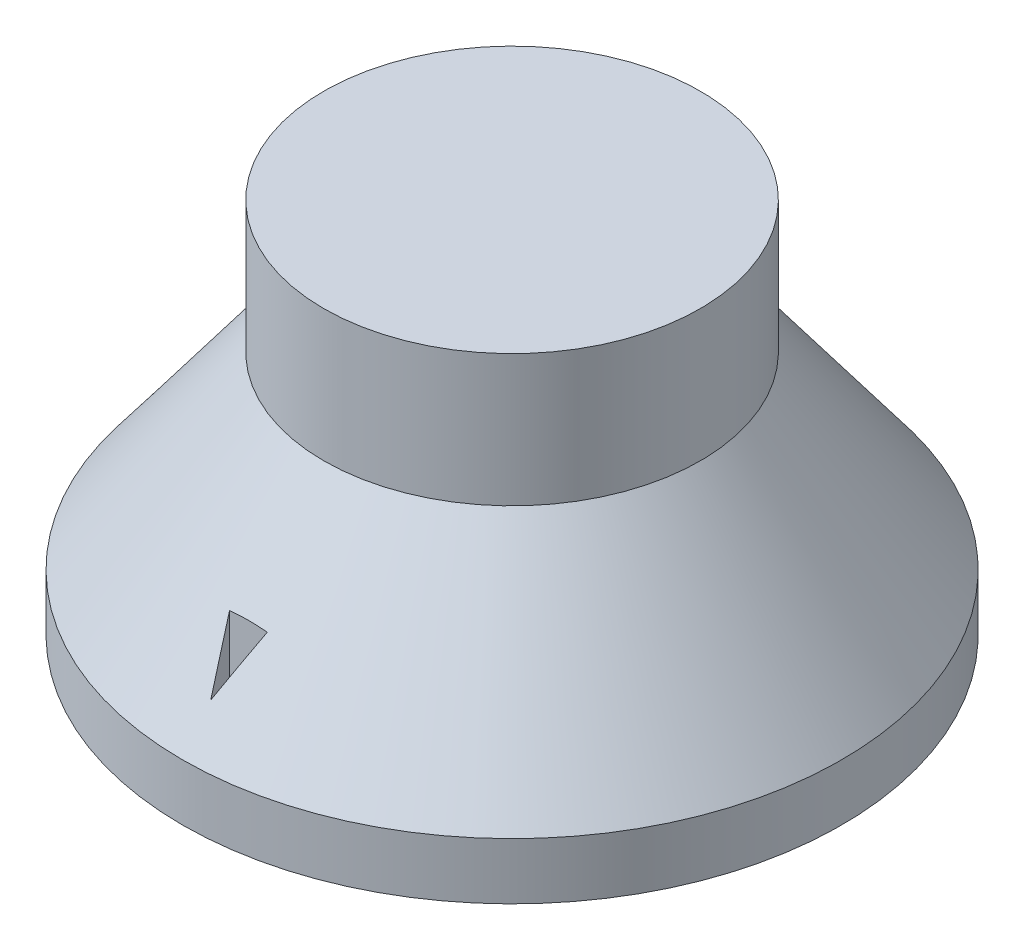
ISO-10303-21;
HEADER;
FILE_DESCRIPTION(('STEP AP214'),'2;1');
FILE_NAME('part.step','',(''),(''),'','','');
FILE_SCHEMA(('AUTOMOTIVE_DESIGN { 1 0 10303 214 1 1 1 1 }'));
ENDSEC;
DATA;
#1=APPLICATION_CONTEXT('core data for automotive mechanical design processes');
#2=APPLICATION_PROTOCOL_DEFINITION('international standard','automotive_design',2000,#1);
#3=PRODUCT_CONTEXT('',#1,'mechanical');
#4=PRODUCT('Part','Part','',(#3));
#5=PRODUCT_RELATED_PRODUCT_CATEGORY('part','',(#4));
#6=PRODUCT_DEFINITION_FORMATION('','',#4);
#7=PRODUCT_DEFINITION_CONTEXT('part definition',#1,'design');
#8=PRODUCT_DEFINITION('design','',#6,#7);
#9=PRODUCT_DEFINITION_SHAPE('','',#8);
#10=(LENGTH_UNIT() NAMED_UNIT(*) SI_UNIT(.MILLI.,.METRE.));
#11=(NAMED_UNIT(*) PLANE_ANGLE_UNIT() SI_UNIT($,.RADIAN.));
#12=(NAMED_UNIT(*) SI_UNIT($,.STERADIAN.) SOLID_ANGLE_UNIT());
#13=UNCERTAINTY_MEASURE_WITH_UNIT(LENGTH_MEASURE(1.E-05),#10,'distance_accuracy_value','');
#14=(GEOMETRIC_REPRESENTATION_CONTEXT(3) GLOBAL_UNCERTAINTY_ASSIGNED_CONTEXT((#13)) GLOBAL_UNIT_ASSIGNED_CONTEXT((#10,
#11,#12)) REPRESENTATION_CONTEXT('',''));
#15=CARTESIAN_POINT('',(0.,0.,0.));
#16=DIRECTION('',(0.,0.,1.));
#17=DIRECTION('',(1.,0.,0.));
#18=AXIS2_PLACEMENT_3D('',#15,#16,#17);
#19=CARTESIAN_POINT('',(0.,0.,0.));
#20=DIRECTION('',(0.,-1.,0.));
#21=DIRECTION('',(0.,0.,-1.));
#22=AXIS2_PLACEMENT_3D('',#19,#20,#21);
#23=PLANE('',#22);
#24=CARTESIAN_POINT('',(0.,0.,0.));
#25=DIRECTION('',(0.,-1.,0.));
#26=DIRECTION('',(0.,0.,-1.));
#27=AXIS2_PLACEMENT_3D('',#24,#25,#26);
#28=CIRCLE('',#27,3.175);
#29=CARTESIAN_POINT('',(0.,0.,-3.175));
#30=VERTEX_POINT('',#29);
#31=CARTESIAN_POINT('',(2.74963065701559,0.,1.5875));
#32=VERTEX_POINT('',#31);
#33=EDGE_CURVE('E658',#30,#32,#28,.T.);
#34=ORIENTED_EDGE('',*,*,#33,.F.);
#35=DIRECTION('',(0.866025403784439,0.,-0.5));
#36=VECTOR('',#35,1.);
#37=CARTESIAN_POINT('',(-1.3748153285078,0.,-2.38125));
#38=LINE('',#37,#36);
#39=CARTESIAN_POINT('',(4.77969102354839,0.,-5.9345558990889));
#40=VERTEX_POINT('',#39);
#41=EDGE_CURVE('E256',#30,#40,#38,.T.);
#42=ORIENTED_EDGE('',*,*,#41,.T.);
#43=CARTESIAN_POINT('',(0.,0.,0.));
#44=DIRECTION('',(0.,-1.,0.));
#45=DIRECTION('',(0.,0.,-1.));
#46=AXIS2_PLACEMENT_3D('',#43,#44,#45);
#47=CIRCLE('',#46,7.62);
#48=CARTESIAN_POINT('',(7.52932168056399,0.,-1.1720558990889));
#49=VERTEX_POINT('',#48);
#50=EDGE_CURVE('E260',#40,#49,#47,.T.);
#51=ORIENTED_EDGE('',*,*,#50,.T.);
#52=DIRECTION('',(-0.866025403784439,0.,0.5));
#53=VECTOR('',#52,1.);
#54=CARTESIAN_POINT('',(1.3748153285078,0.,2.38125));
#55=LINE('',#54,#53);
#56=EDGE_CURVE('E265',#49,#32,#55,.T.);
#57=ORIENTED_EDGE('',*,*,#56,.T.);
#58=EDGE_LOOP('',(#34,#42,#51,#57));
#59=FACE_BOUND('',#58,.T.);
#60=ADVANCED_FACE('F16',(#59),#23,.T.);
#61=CARTESIAN_POINT('',(-2.74963065701559,0.,1.5875));
#62=VERTEX_POINT('',#61);
#63=EDGE_CURVE('E655',#32,#62,#28,.T.);
#64=ORIENTED_EDGE('',*,*,#63,.F.);
#65=DIRECTION('',(0.,0.,1.));
#66=VECTOR('',#65,1.);
#67=CARTESIAN_POINT('',(2.74963065701559,0.,0.));
#68=LINE('',#67,#66);
#69=CARTESIAN_POINT('',(2.74963065701559,0.,7.10661179817781));
#70=VERTEX_POINT('',#69);
#71=EDGE_CURVE('E278',#32,#70,#68,.T.);
#72=ORIENTED_EDGE('',*,*,#71,.T.);
#73=CARTESIAN_POINT('',(0.,0.,0.));
#74=DIRECTION('',(0.,-1.,0.));
#75=DIRECTION('',(0.,0.,-1.));
#76=AXIS2_PLACEMENT_3D('',#73,#74,#75);
#77=CIRCLE('',#76,7.62);
#78=CARTESIAN_POINT('',(-2.74963065701559,0.,7.1066117981778));
#79=VERTEX_POINT('',#78);
#80=EDGE_CURVE('E282',#70,#79,#77,.T.);
#81=ORIENTED_EDGE('',*,*,#80,.T.);
#82=DIRECTION('',(0.,0.,-1.));
#83=VECTOR('',#82,1.);
#84=CARTESIAN_POINT('',(-2.74963065701559,0.,0.));
#85=LINE('',#84,#83);
#86=EDGE_CURVE('E287',#79,#62,#85,.T.);
#87=ORIENTED_EDGE('',*,*,#86,.T.);
#88=EDGE_LOOP('',(#64,#72,#81,#87));
#89=FACE_BOUND('',#88,.T.);
#90=ADVANCED_FACE('F401',(#89),#23,.T.);
#91=CARTESIAN_POINT('',(0.,12.7,0.));
#92=DIRECTION('',(0.,-1.,0.));
#93=DIRECTION('',(0.,0.,-1.));
#94=AXIS2_PLACEMENT_3D('',#91,#92,#93);
#95=CONICAL_SURFACE('',#94,12.7,0.643501108793284);
#96=CARTESIAN_POINT('',(0.,0.,0.));
#97=DIRECTION('',(0.,1.,0.));
#98=DIRECTION('',(0.,0.,1.));
#99=AXIS2_PLACEMENT_3D('',#96,#97,#98);
#100=CIRCLE('',#99,22.225);
#101=CARTESIAN_POINT('',(0.,0.,22.225));
#102=VERTEX_POINT('',#101);
#103=EDGE_CURVE('E376',#102,#102,#100,.T.);
#104=ORIENTED_EDGE('',*,*,#103,.T.);
#105=EDGE_LOOP('',(#104));
#106=FACE_BOUND('',#105,.T.);
#107=CARTESIAN_POINT('',(0.,12.7,0.));
#108=DIRECTION('',(0.,1.,0.));
#109=DIRECTION('',(0.,0.,1.));
#110=AXIS2_PLACEMENT_3D('',#107,#108,#109);
#111=CIRCLE('',#110,12.7);
#112=CARTESIAN_POINT('',(0.,12.7,12.7));
#113=VERTEX_POINT('',#112);
#114=EDGE_CURVE('E10',#113,#113,#111,.T.);
#115=ORIENTED_EDGE('',*,*,#114,.F.);
#116=EDGE_LOOP('',(#115));
#117=FACE_BOUND('',#116,.T.);
#118=CARTESIAN_POINT('',(1.2701,5.86652390692712,17.7798));
#119=CARTESIAN_POINT('',(1.1629716888854,5.59174236568698,17.9940566222292));
#120=CARTESIAN_POINT('',(1.05621004871273,5.31624780296918,18.2075799025745));
#121=CARTESIAN_POINT('',(0.843349553580448,4.76399211063045,18.6333008928391));
#122=CARTESIAN_POINT('',(0.737250683513074,4.48723101013108,18.8454986329739));
#123=CARTESIAN_POINT('',(0.525640731324512,3.93259032260224,19.268718537351));
#124=CARTESIAN_POINT('',(0.420129646679655,3.65471074038385,19.4797407066407));
#125=CARTESIAN_POINT('',(0.20963395631367,3.09794527284853,19.9007320873727));
#126=CARTESIAN_POINT('',(0.10464936268366,2.81905936467146,20.1107012746327));
#127=CARTESIAN_POINT('',(-0.000100000000017459,2.53973333300529,20.3202));
#128=B_SPLINE_CURVE_WITH_KNOTS('',3,(#118,#119,#120,#121,#122,#123,#124,#125,#126,#127),
.UNSPECIFIED.,.F.,.F.,(4,2,2,2,4),(0.,1.09360768033873,2.1871903404029,3.2807683015217,
4.37437126321508),.UNSPECIFIED.);
#129=CARTESIAN_POINT('',(1.27,5.86626741803318,17.78));
#130=VERTEX_POINT('',#129);
#131=CARTESIAN_POINT('',(0.,2.54,20.32));
#132=VERTEX_POINT('',#131);
#133=EDGE_CURVE('E170',#130,#132,#128,.T.);
#134=ORIENTED_EDGE('',*,*,#133,.T.);
#135=CARTESIAN_POINT('',(0.000100000000000184,2.53973333300526,20.3202));
#136=CARTESIAN_POINT('',(-0.104649362683665,2.81905936467145,20.1107012746327));
#137=CARTESIAN_POINT('',(-0.20963395631367,3.09794527284853,19.9007320873727));
#138=CARTESIAN_POINT('',(-0.420129646679652,3.65471074038386,19.4797407066407));
#139=CARTESIAN_POINT('',(-0.525640731324511,3.93259032260225,19.268718537351));
#140=CARTESIAN_POINT('',(-0.737250683513073,4.48723101013108,18.8454986329739));
#141=CARTESIAN_POINT('',(-0.843349553580447,4.76399211063046,18.6333008928391));
#142=CARTESIAN_POINT('',(-1.05621004871273,5.31624780296918,18.2075799025745));
#143=CARTESIAN_POINT('',(-1.1629716888854,5.59174236568698,17.9940566222292));
#144=CARTESIAN_POINT('',(-1.2701,5.86652390692713,17.7798));
#145=B_SPLINE_CURVE_WITH_KNOTS('',3,(#135,#136,#137,#138,#139,#140,#141,#142,#143,#144),
.UNSPECIFIED.,.F.,.F.,(4,2,2,2,4),(0.,1.09360296169338,2.18718092281218,3.28076358287635,
4.37437126321508),.UNSPECIFIED.);
#146=CARTESIAN_POINT('',(-1.27,5.86626741803318,17.78));
#147=VERTEX_POINT('',#146);
#148=EDGE_CURVE('E39',#132,#147,#145,.T.);
#149=ORIENTED_EDGE('',*,*,#148,.T.);
#150=CARTESIAN_POINT('',(-14.2217095645257,-0.724105379815956,17.78));
#151=CARTESIAN_POINT('',(-13.9453417803753,-0.493960475211913,17.78));
#152=CARTESIAN_POINT('',(-13.6669740552298,-0.266189689392707,17.78));
#153=CARTESIAN_POINT('',(-13.1057793867715,0.183885731205781,17.78));
#154=CARTESIAN_POINT('',(-12.8229516881035,0.406189423382434,17.78));
#155=CARTESIAN_POINT('',(-12.2515097967928,0.845272822030037,17.78));
#156=CARTESIAN_POINT('',(-11.9628793015656,1.06203136237858,17.78));
#157=CARTESIAN_POINT('',(-11.3803168810772,1.48828989595809,17.78));
#158=CARTESIAN_POINT('',(-11.0863851891637,1.69779020750148,17.78));
#159=CARTESIAN_POINT('',(-10.4845056668631,2.11412000153583,17.78));
#160=CARTESIAN_POINT('',(-10.1763950970819,2.32071490084571,17.78));
#161=CARTESIAN_POINT('',(-9.55353420085356,2.72363229249924,17.78));
#162=CARTESIAN_POINT('',(-9.23878424329459,2.91995535345384,17.78));
#163=CARTESIAN_POINT('',(-8.60247933753102,3.30041227325596,17.78));
#164=CARTESIAN_POINT('',(-8.28093295159779,3.48456038812244,17.78));
#165=CARTESIAN_POINT('',(-7.63027002451364,3.83888975819152,17.78));
#166=CARTESIAN_POINT('',(-7.30115439209823,4.00907267891237,17.78));
#167=CARTESIAN_POINT('',(-6.57632764241677,4.36170652745785,17.78));
#168=CARTESIAN_POINT('',(-6.17908380335586,4.54105142660425,17.78));
#169=CARTESIAN_POINT('',(-5.57496968995983,4.78992943527321,17.78));
#170=CARTESIAN_POINT('',(-5.37221973029758,4.86953351314337,17.78));
#171=CARTESIAN_POINT('',(-4.96394084086913,5.02147895775422,17.78));
#172=CARTESIAN_POINT('',(-4.75841099727359,5.09381786697227,17.78));
#173=CARTESIAN_POINT('',(-4.14110453112222,5.29792979423261,17.78));
#174=CARTESIAN_POINT('',(-3.72540429880946,5.41813598116665,17.78));
#175=CARTESIAN_POINT('',(-2.88537082248133,5.62284001946747,17.78));
#176=CARTESIAN_POINT('',(-2.46104022443617,5.70734864734677,17.78));
#177=CARTESIAN_POINT('',(-1.59992999247312,5.83781028628777,17.78));
#178=CARTESIAN_POINT('',(-1.16305906908108,5.8831710463077,17.78));
#179=CARTESIAN_POINT('',(-0.286970966874987,5.93076007860252,17.78));
#180=CARTESIAN_POINT('',(0.152246065540865,5.93299101146049,17.78));
#181=CARTESIAN_POINT('',(1.02933424486265,5.89417534647705,17.78));
#182=CARTESIAN_POINT('',(1.4672027742966,5.85307031898868,17.78));
#183=CARTESIAN_POINT('',(2.33707239284897,5.72970930477202,17.78));
#184=CARTESIAN_POINT('',(2.76907252234159,5.64744666903519,17.78));
#185=CARTESIAN_POINT('',(3.70691286519135,5.42617543036027,17.78));
#186=CARTESIAN_POINT('',(4.2108798388819,5.27927025757113,17.78));
#187=CARTESIAN_POINT('',(5.20343379731154,4.94060875267613,17.78));
#188=CARTESIAN_POINT('',(5.69201501229711,4.74883581688339,17.78));
#189=CARTESIAN_POINT('',(6.65601695424864,4.32730524526613,17.78));
#190=CARTESIAN_POINT('',(7.13133447894783,4.09731426355569,17.78));
#191=CARTESIAN_POINT('',(8.06611488246802,3.60750488701052,17.78));
#192=CARTESIAN_POINT('',(8.52557955341287,3.34768987816806,17.78));
#193=CARTESIAN_POINT('',(9.44511076580176,2.79506916718482,17.78));
#194=CARTESIAN_POINT('',(9.9046862927344,2.50145216627478,17.78));
#195=CARTESIAN_POINT('',(10.8101436931138,1.89376422385902,17.78));
#196=CARTESIAN_POINT('',(11.2560229431395,1.57968939931708,17.78));
#197=CARTESIAN_POINT('',(12.1276954042924,0.940964767012807,17.78));
#198=CARTESIAN_POINT('',(12.5537064062534,0.616610991205184,17.78));
#199=CARTESIAN_POINT('',(13.1849003239372,0.120512728843975,17.78));
#200=CARTESIAN_POINT('',(13.3939200045589,-0.0463855806009546,17.78));
#201=CARTESIAN_POINT('',(13.8095648687637,-0.38311460152842,17.78));
#202=CARTESIAN_POINT('',(14.0161901896834,-0.552945143417687,17.78));
#203=CARTESIAN_POINT('',(14.2217095645257,-0.724105379815957,17.78));
#204=B_SPLINE_CURVE_WITH_KNOTS('',3,(#150,#151,#152,#153,#154,#155,#156,#157,#158,#159,#160,
#161,#162,#163,#164,#165,#166,#167,#168,#169,#170,#171,#172,#173,#174,#175,#176,#177,#178,#179,
#180,#181,#182,#183,#184,#185,#186,#187,#188,#189,#190,#191,#192,#193,#194,#195,#196,#197,#198,
#199,#200,#201,#202,#203),.UNSPECIFIED.,.F.,.F.,(4,2,2,2,2,2,2,2,2,2,2,2,2,2,2,2,2,2,2,2,2,2,2,
2,2,2,4),(0.,1.07895313402921,2.158091008526,3.24086951272924,4.32360047099888,5.43631198193214,
6.54896183196604,7.66028488712575,8.77147521036334,10.0780859440909,10.7314157091665,
11.3849657310643,12.6816673773663,13.9779772902867,15.2935709932361,16.6090835398782,
17.9263720562568,19.2438734492446,20.8161170003875,22.3889432961075,23.9717515440636,
25.5543802694607,27.1897928205692,28.8255166939466,30.4315051052063,31.2339164136595,
32.036281467015),.UNSPECIFIED.);
#205=EDGE_CURVE('E190',#147,#130,#204,.T.);
#206=ORIENTED_EDGE('',*,*,#205,.T.);
#207=EDGE_LOOP('',(#134,#149,#206));
#208=FACE_BOUND('',#207,.T.);
#209=ADVANCED_FACE('F18',(#106,#117,#208),#95,.T.);
#210=EDGE_CURVE('E231',#62,#30,#28,.T.);
#211=ORIENTED_EDGE('',*,*,#210,.F.);
#212=DIRECTION('',(-0.866025403784438,0.,-0.5));
#213=VECTOR('',#212,1.);
#214=CARTESIAN_POINT('',(-1.3748153285078,0.,2.38125));
#215=LINE('',#214,#213);
#216=CARTESIAN_POINT('',(-7.52932168056399,0.,-1.1720558990889));
#217=VERTEX_POINT('',#216);
#218=EDGE_CURVE('E232',#62,#217,#215,.T.);
#219=ORIENTED_EDGE('',*,*,#218,.T.);
#220=CARTESIAN_POINT('',(0.,0.,0.));
#221=DIRECTION('',(0.,-1.,0.));
#222=DIRECTION('',(0.,0.,-1.));
#223=AXIS2_PLACEMENT_3D('',#220,#221,#222);
#224=CIRCLE('',#223,7.62);
#225=CARTESIAN_POINT('',(-4.77969102354839,0.,-5.9345558990889));
#226=VERTEX_POINT('',#225);
#227=EDGE_CURVE('E236',#217,#226,#224,.T.);
#228=ORIENTED_EDGE('',*,*,#227,.T.);
#229=DIRECTION('',(0.866025403784439,0.,0.5));
#230=VECTOR('',#229,1.);
#231=CARTESIAN_POINT('',(1.3748153285078,0.,-2.38125));
#232=LINE('',#231,#230);
#233=EDGE_CURVE('E241',#226,#30,#232,.T.);
#234=ORIENTED_EDGE('',*,*,#233,.T.);
#235=EDGE_LOOP('',(#211,#219,#228,#234));
#236=FACE_BOUND('',#235,.T.);
#237=ADVANCED_FACE('F400',(#236),#23,.T.);
#238=CARTESIAN_POINT('',(0.,-23.2210244842766,0.));
#239=DIRECTION('',(0.,1.,0.));
#240=DIRECTION('',(0.,0.,1.));
#241=AXIS2_PLACEMENT_3D('',#238,#239,#240);
#242=CYLINDRICAL_SURFACE('',#241,12.7);
#243=ORIENTED_EDGE('',*,*,#114,.T.);
#244=EDGE_LOOP('',(#243));
#245=FACE_BOUND('',#244,.T.);
#246=CARTESIAN_POINT('',(0.,21.59,0.));
#247=DIRECTION('',(0.,1.,0.));
#248=DIRECTION('',(0.,0.,1.));
#249=AXIS2_PLACEMENT_3D('',#246,#247,#248);
#250=CIRCLE('',#249,12.7);
#251=CARTESIAN_POINT('',(0.,21.59,12.7));
#252=VERTEX_POINT('',#251);
#253=EDGE_CURVE('E26',#252,#252,#250,.T.);
#254=ORIENTED_EDGE('',*,*,#253,.F.);
#255=EDGE_LOOP('',(#254));
#256=FACE_BOUND('',#255,.T.);
#257=ADVANCED_FACE('F510',(#245,#256),#242,.T.);
#258=CARTESIAN_POINT('',(0.,21.59,0.));
#259=DIRECTION('',(0.,1.,0.));
#260=DIRECTION('',(0.,0.,1.));
#261=AXIS2_PLACEMENT_3D('',#258,#259,#260);
#262=PLANE('',#261);
#263=ORIENTED_EDGE('',*,*,#253,.T.);
#264=EDGE_LOOP('',(#263));
#265=FACE_BOUND('',#264,.T.);
#266=ADVANCED_FACE('F394',(#265),#262,.T.);
#267=CARTESIAN_POINT('',(0.,-3.81,0.));
#268=DIRECTION('',(0.,1.,0.));
#269=DIRECTION('',(0.,0.,1.));
#270=AXIS2_PLACEMENT_3D('',#267,#268,#269);
#271=CYLINDRICAL_SURFACE('',#270,22.225);
#272=CARTESIAN_POINT('',(0.,-3.81,0.));
#273=DIRECTION('',(0.,1.,0.));
#274=DIRECTION('',(0.,0.,1.));
#275=AXIS2_PLACEMENT_3D('',#272,#273,#274);
#276=CIRCLE('',#275,22.225);
#277=CARTESIAN_POINT('',(0.,-3.81,22.225));
#278=VERTEX_POINT('',#277);
#279=EDGE_CURVE('E380',#278,#278,#276,.F.);
#280=CARTESIAN_POINT('',(0.,-3.81,22.225));
#281=CARTESIAN_POINT('',(0.,-3.7703125,22.225));
#282=CARTESIAN_POINT('',(0.,-3.730625,22.225));
#283=CARTESIAN_POINT('',(0.,-3.65125,22.225));
#284=CARTESIAN_POINT('',(0.,-3.6115625,22.225));
#285=CARTESIAN_POINT('',(0.,-3.5321875,22.225));
#286=CARTESIAN_POINT('',(0.,-3.4925,22.225));
#287=CARTESIAN_POINT('',(0.,-3.413125,22.225));
#288=CARTESIAN_POINT('',(0.,-3.3734375,22.225));
#289=CARTESIAN_POINT('',(0.,-3.2940625,22.225));
#290=CARTESIAN_POINT('',(0.,-3.254375,22.225));
#291=CARTESIAN_POINT('',(0.,-3.175,22.225));
#292=CARTESIAN_POINT('',(0.,-3.1353125,22.225));
#293=CARTESIAN_POINT('',(0.,-3.0559375,22.225));
#294=CARTESIAN_POINT('',(0.,-3.01625,22.225));
#295=CARTESIAN_POINT('',(0.,-2.936875,22.225));
#296=CARTESIAN_POINT('',(0.,-2.8971875,22.225));
#297=CARTESIAN_POINT('',(0.,-2.8178125,22.225));
#298=CARTESIAN_POINT('',(0.,-2.778125,22.225));
#299=CARTESIAN_POINT('',(0.,-2.69875,22.225));
#300=CARTESIAN_POINT('',(0.,-2.6590625,22.225));
#301=CARTESIAN_POINT('',(0.,-2.5796875,22.225));
#302=CARTESIAN_POINT('',(0.,-2.54,22.225));
#303=CARTESIAN_POINT('',(0.,-2.460625,22.225));
#304=CARTESIAN_POINT('',(0.,-2.4209375,22.225));
#305=CARTESIAN_POINT('',(0.,-2.3415625,22.225));
#306=CARTESIAN_POINT('',(0.,-2.301875,22.225));
#307=CARTESIAN_POINT('',(0.,-2.2225,22.225));
#308=CARTESIAN_POINT('',(0.,-2.1828125,22.225));
#309=CARTESIAN_POINT('',(0.,-2.1034375,22.225));
#310=CARTESIAN_POINT('',(0.,-2.06375,22.225));
#311=CARTESIAN_POINT('',(0.,-1.984375,22.225));
#312=CARTESIAN_POINT('',(0.,-1.9446875,22.225));
#313=CARTESIAN_POINT('',(0.,-1.8653125,22.225));
#314=CARTESIAN_POINT('',(0.,-1.825625,22.225));
#315=CARTESIAN_POINT('',(0.,-1.74625,22.225));
#316=CARTESIAN_POINT('',(0.,-1.7065625,22.225));
#317=CARTESIAN_POINT('',(0.,-1.6271875,22.225));
#318=CARTESIAN_POINT('',(0.,-1.5875,22.225));
#319=CARTESIAN_POINT('',(0.,-1.508125,22.225));
#320=CARTESIAN_POINT('',(0.,-1.4684375,22.225));
#321=CARTESIAN_POINT('',(0.,-1.3890625,22.225));
#322=CARTESIAN_POINT('',(0.,-1.349375,22.225));
#323=CARTESIAN_POINT('',(0.,-1.27,22.225));
#324=CARTESIAN_POINT('',(0.,-1.2303125,22.225));
#325=CARTESIAN_POINT('',(0.,-1.1509375,22.225));
#326=CARTESIAN_POINT('',(0.,-1.11125,22.225));
#327=CARTESIAN_POINT('',(0.,-1.031875,22.225));
#328=CARTESIAN_POINT('',(0.,-0.9921875,22.225));
#329=CARTESIAN_POINT('',(0.,-0.9128125,22.225));
#330=CARTESIAN_POINT('',(0.,-0.873125,22.225));
#331=CARTESIAN_POINT('',(0.,-0.79375,22.225));
#332=CARTESIAN_POINT('',(0.,-0.7540625,22.225));
#333=CARTESIAN_POINT('',(0.,-0.6746875,22.225));
#334=CARTESIAN_POINT('',(0.,-0.635,22.225));
#335=CARTESIAN_POINT('',(0.,-0.555625,22.225));
#336=CARTESIAN_POINT('',(0.,-0.5159375,22.225));
#337=CARTESIAN_POINT('',(0.,-0.4365625,22.225));
#338=CARTESIAN_POINT('',(0.,-0.396875,22.225));
#339=CARTESIAN_POINT('',(0.,-0.3175,22.225));
#340=CARTESIAN_POINT('',(0.,-0.2778125,22.225));
#341=CARTESIAN_POINT('',(0.,-0.1984375,22.225));
#342=CARTESIAN_POINT('',(0.,-0.15875,22.225));
#343=CARTESIAN_POINT('',(0.,-0.0793749999999999,22.225));
#344=CARTESIAN_POINT('',(0.,-0.0396874999999999,22.225));
#345=CARTESIAN_POINT('',(0.,0.,22.225));
#346=B_SPLINE_CURVE_WITH_KNOTS('',3,(#280,#281,#282,#283,#284,#285,#286,#287,#288,#289,#290,
#291,#292,#293,#294,#295,#296,#297,#298,#299,#300,#301,#302,#303,#304,#305,#306,#307,#308,#309,
#310,#311,#312,#313,#314,#315,#316,#317,#318,#319,#320,#321,#322,#323,#324,#325,#326,#327,#328,
#329,#330,#331,#332,#333,#334,#335,#336,#337,#338,#339,#340,#341,#342,#343,#344,#345),
.UNSPECIFIED.,.F.,.F.,(4,2,2,2,2,2,2,2,2,2,2,2,2,2,2,2,2,2,2,2,2,2,2,2,2,2,2,2,2,2,2,2,4),(0.,
0.1190625,0.238125,0.3571875,0.47625,0.5953125,0.714375,0.833437499999999,0.9525,1.0715625,
1.190625,1.3096875,1.42875,1.5478125,1.666875,1.7859375,1.905,2.0240625,2.143125,2.2621875,
2.38125,2.5003125,2.619375,2.7384375,2.8575,2.9765625,3.095625,3.2146875,3.33375,3.4528125,
3.571875,3.6909375,3.81),.UNSPECIFIED.);
#347=EDGE_CURVE('BSEAM391',#278,#102,#346,.T.);
#348=ORIENTED_EDGE('',*,*,#279,.F.);
#349=ORIENTED_EDGE('',*,*,#103,.F.);
#350=ORIENTED_EDGE('',*,*,#347,.T.);
#351=ORIENTED_EDGE('',*,*,#347,.F.);
#352=EDGE_LOOP('',(#348,#350,#349,#351));
#353=FACE_BOUND('',#352,.T.);
#354=ADVANCED_FACE('F391',(#353),#271,.T.);
#355=CARTESIAN_POINT('',(0.,-3.81,0.));
#356=DIRECTION('',(0.,-1.,0.));
#357=DIRECTION('',(0.,0.,-1.));
#358=AXIS2_PLACEMENT_3D('',#355,#356,#357);
#359=PLANE('',#358);
#360=CARTESIAN_POINT('',(0.,-3.81,0.));
#361=DIRECTION('',(0.,-1.,0.));
#362=DIRECTION('',(0.,0.,-1.));
#363=AXIS2_PLACEMENT_3D('',#360,#361,#362);
#364=CIRCLE('',#363,7.62);
#365=CARTESIAN_POINT('',(-7.52932168056399,-3.81,-1.1720558990889));
#366=VERTEX_POINT('',#365);
#367=CARTESIAN_POINT('',(-4.77969102354839,-3.81,-5.9345558990889));
#368=VERTEX_POINT('',#367);
#369=EDGE_CURVE('E237',#366,#368,#364,.T.);
#370=ORIENTED_EDGE('',*,*,#369,.F.);
#371=CARTESIAN_POINT('',(0.,-3.81,0.));
#372=DIRECTION('',(0.,-1.,0.));
#373=DIRECTION('',(0.,0.,-1.));
#374=AXIS2_PLACEMENT_3D('',#371,#372,#373);
#375=CIRCLE('',#374,7.62);
#376=CARTESIAN_POINT('',(-2.74963065701559,-3.81,7.1066117981778));
#377=VERTEX_POINT('',#376);
#378=EDGE_CURVE('E253',#377,#366,#375,.T.);
#379=ORIENTED_EDGE('',*,*,#378,.F.);
#380=CARTESIAN_POINT('',(0.,-3.81,0.));
#381=DIRECTION('',(0.,-1.,0.));
#382=DIRECTION('',(0.,0.,-1.));
#383=AXIS2_PLACEMENT_3D('',#380,#381,#382);
#384=CIRCLE('',#383,7.62);
#385=CARTESIAN_POINT('',(2.74963065701559,-3.81,7.10661179817781));
#386=VERTEX_POINT('',#385);
#387=EDGE_CURVE('E283',#386,#377,#384,.T.);
#388=ORIENTED_EDGE('',*,*,#387,.F.);
#389=CARTESIAN_POINT('',(0.,-3.81,0.));
#390=DIRECTION('',(0.,-1.,0.));
#391=DIRECTION('',(0.,0.,-1.));
#392=AXIS2_PLACEMENT_3D('',#389,#390,#391);
#393=CIRCLE('',#392,7.62);
#394=CARTESIAN_POINT('',(7.52932168056399,-3.81,-1.1720558990889));
#395=VERTEX_POINT('',#394);
#396=EDGE_CURVE('E353',#395,#386,#393,.T.);
#397=ORIENTED_EDGE('',*,*,#396,.F.);
#398=CARTESIAN_POINT('',(0.,-3.81,0.));
#399=DIRECTION('',(0.,-1.,0.));
#400=DIRECTION('',(0.,0.,-1.));
#401=AXIS2_PLACEMENT_3D('',#398,#399,#400);
#402=CIRCLE('',#401,7.62);
#403=CARTESIAN_POINT('',(4.77969102354839,-3.81,-5.9345558990889));
#404=VERTEX_POINT('',#403);
#405=EDGE_CURVE('E261',#404,#395,#402,.T.);
#406=ORIENTED_EDGE('',*,*,#405,.F.);
#407=CARTESIAN_POINT('',(0.,-3.81,0.));
#408=DIRECTION('',(0.,-1.,0.));
#409=DIRECTION('',(0.,0.,-1.));
#410=AXIS2_PLACEMENT_3D('',#407,#408,#409);
#411=CIRCLE('',#410,7.62);
#412=EDGE_CURVE('E326',#368,#404,#411,.T.);
#413=ORIENTED_EDGE('',*,*,#412,.F.);
#414=EDGE_LOOP('',(#370,#379,#388,#397,#406,#413));
#415=FACE_BOUND('',#414,.T.);
#416=ORIENTED_EDGE('',*,*,#279,.T.);
#417=EDGE_LOOP('',(#416));
#418=FACE_BOUND('',#417,.T.);
#419=ADVANCED_FACE('F389',(#415,#418),#359,.T.);
#420=CARTESIAN_POINT('',(1.3748153285078,-10.16,2.38125));
#421=DIRECTION('',(-0.5,0.,-0.866025403784439));
#422=DIRECTION('',(-0.866025403784439,0.,0.5));
#423=AXIS2_PLACEMENT_3D('',#420,#421,#422);
#424=PLANE('',#423);
#425=DIRECTION('',(0.,1.,0.));
#426=VECTOR('',#425,1.);
#427=CARTESIAN_POINT('',(2.74963065701559,-10.16,1.5875));
#428=LINE('',#427,#426);
#429=CARTESIAN_POINT('',(2.74963065701559,-10.16,1.5875));
#430=VERTEX_POINT('',#429);
#431=EDGE_CURVE('E51',#430,#32,#428,.T.);
#432=ORIENTED_EDGE('',*,*,#431,.T.);
#433=ORIENTED_EDGE('',*,*,#56,.F.);
#434=DIRECTION('',(0.,-1.,0.));
#435=VECTOR('',#434,1.);
#436=CARTESIAN_POINT('',(7.52932168056399,0.,-1.1720558990889));
#437=LINE('',#436,#435);
#438=EDGE_CURVE('E249',#49,#395,#437,.T.);
#439=ORIENTED_EDGE('',*,*,#438,.T.);
#440=DIRECTION('',(0.,1.,0.));
#441=VECTOR('',#440,1.);
#442=CARTESIAN_POINT('',(7.52932168056399,-10.16,-1.1720558990889));
#443=LINE('',#442,#441);
#444=CARTESIAN_POINT('',(7.52932168056399,-10.16,-1.1720558990889));
#445=VERTEX_POINT('',#444);
#446=EDGE_CURVE('E372',#445,#395,#443,.T.);
#447=ORIENTED_EDGE('',*,*,#446,.F.);
#448=DIRECTION('',(-0.866025403784439,0.,0.5));
#449=VECTOR('',#448,1.);
#450=CARTESIAN_POINT('',(1.3748153285078,-10.16,2.38125));
#451=LINE('',#450,#449);
#452=EDGE_CURVE('E354',#445,#430,#451,.T.);
#453=ORIENTED_EDGE('',*,*,#452,.T.);
#454=EDGE_LOOP('',(#432,#433,#439,#447,#453));
#455=FACE_BOUND('',#454,.T.);
#456=ADVANCED_FACE('F1038',(#455),#424,.T.);
#457=CARTESIAN_POINT('',(0.,-10.16,0.));
#458=DIRECTION('',(0.,1.,0.));
#459=DIRECTION('',(0.,0.,1.));
#460=AXIS2_PLACEMENT_3D('',#457,#458,#459);
#461=CYLINDRICAL_SURFACE('',#460,7.62);
#462=ORIENTED_EDGE('',*,*,#396,.T.);
#463=DIRECTION('',(0.,1.,0.));
#464=VECTOR('',#463,1.);
#465=CARTESIAN_POINT('',(2.74963065701559,-10.16,7.10661179817781));
#466=LINE('',#465,#464);
#467=CARTESIAN_POINT('',(2.74963065701559,-10.16,7.10661179817781));
#468=VERTEX_POINT('',#467);
#469=EDGE_CURVE('E368',#468,#386,#466,.T.);
#470=ORIENTED_EDGE('',*,*,#469,.F.);
#471=CARTESIAN_POINT('',(0.,-10.16,0.));
#472=DIRECTION('',(0.,-1.,0.));
#473=DIRECTION('',(0.,0.,-1.));
#474=AXIS2_PLACEMENT_3D('',#471,#472,#473);
#475=CIRCLE('',#474,7.62);
#476=EDGE_CURVE('E357',#445,#468,#475,.T.);
#477=ORIENTED_EDGE('',*,*,#476,.F.);
#478=ORIENTED_EDGE('',*,*,#446,.T.);
#479=EDGE_LOOP('',(#462,#470,#477,#478));
#480=FACE_BOUND('',#479,.T.);
#481=ADVANCED_FACE('F592',(#480),#461,.T.);
#482=CARTESIAN_POINT('',(2.74963065701559,-10.16,0.));
#483=DIRECTION('',(-1.,0.,0.));
#484=DIRECTION('',(0.,0.,1.));
#485=AXIS2_PLACEMENT_3D('',#482,#483,#484);
#486=PLANE('',#485);
#487=ORIENTED_EDGE('',*,*,#469,.T.);
#488=DIRECTION('',(0.,-1.,0.));
#489=VECTOR('',#488,1.);
#490=CARTESIAN_POINT('',(2.74963065701559,0.,7.10661179817781));
#491=LINE('',#490,#489);
#492=EDGE_CURVE('E291',#70,#386,#491,.T.);
#493=ORIENTED_EDGE('',*,*,#492,.F.);
#494=ORIENTED_EDGE('',*,*,#71,.F.);
#495=ORIENTED_EDGE('',*,*,#431,.F.);
#496=DIRECTION('',(0.,0.,1.));
#497=VECTOR('',#496,1.);
#498=CARTESIAN_POINT('',(2.74963065701559,-10.16,0.));
#499=LINE('',#498,#497);
#500=EDGE_CURVE('E360',#430,#468,#499,.T.);
#501=ORIENTED_EDGE('',*,*,#500,.T.);
#502=EDGE_LOOP('',(#487,#493,#494,#495,#501));
#503=FACE_BOUND('',#502,.T.);
#504=ADVANCED_FACE('F456',(#503),#486,.T.);
#505=CARTESIAN_POINT('',(0.,-10.16,0.));
#506=DIRECTION('',(0.,-1.,0.));
#507=DIRECTION('',(0.,0.,-1.));
#508=AXIS2_PLACEMENT_3D('',#505,#506,#507);
#509=PLANE('',#508);
#510=ORIENTED_EDGE('',*,*,#452,.F.);
#511=ORIENTED_EDGE('',*,*,#476,.T.);
#512=ORIENTED_EDGE('',*,*,#500,.F.);
#513=EDGE_LOOP('',(#510,#511,#512));
#514=FACE_BOUND('',#513,.T.);
#515=ADVANCED_FACE('F451',(#514),#509,.T.);
#516=CARTESIAN_POINT('',(1.3748153285078,-10.16,-2.38125));
#517=DIRECTION('',(-0.5,0.,0.866025403784439));
#518=DIRECTION('',(0.866025403784439,0.,0.5));
#519=AXIS2_PLACEMENT_3D('',#516,#517,#518);
#520=PLANE('',#519);
#521=DIRECTION('',(0.,1.,0.));
#522=VECTOR('',#521,1.);
#523=CARTESIAN_POINT('',(0.,-10.16,-3.175));
#524=LINE('',#523,#522);
#525=CARTESIAN_POINT('',(0.,-10.16,-3.175));
#526=VERTEX_POINT('',#525);
#527=EDGE_CURVE('E338',#526,#30,#524,.T.);
#528=ORIENTED_EDGE('',*,*,#527,.T.);
#529=ORIENTED_EDGE('',*,*,#233,.F.);
#530=DIRECTION('',(0.,-1.,0.));
#531=VECTOR('',#530,1.);
#532=CARTESIAN_POINT('',(-4.77969102354839,0.,-5.9345558990889));
#533=LINE('',#532,#531);
#534=EDGE_CURVE('E250',#226,#368,#533,.T.);
#535=ORIENTED_EDGE('',*,*,#534,.T.);
#536=DIRECTION('',(0.,1.,0.));
#537=VECTOR('',#536,1.);
#538=CARTESIAN_POINT('',(-4.77969102354839,-10.16,-5.9345558990889));
#539=LINE('',#538,#537);
#540=CARTESIAN_POINT('',(-4.77969102354839,-10.16,-5.9345558990889));
#541=VERTEX_POINT('',#540);
#542=EDGE_CURVE('E349',#541,#368,#539,.T.);
#543=ORIENTED_EDGE('',*,*,#542,.F.);
#544=DIRECTION('',(0.866025403784439,0.,0.5));
#545=VECTOR('',#544,1.);
#546=CARTESIAN_POINT('',(1.3748153285078,-10.16,-2.38125));
#547=LINE('',#546,#545);
#548=EDGE_CURVE('E327',#541,#526,#547,.T.);
#549=ORIENTED_EDGE('',*,*,#548,.T.);
#550=EDGE_LOOP('',(#528,#529,#535,#543,#549));
#551=FACE_BOUND('',#550,.T.);
#552=ADVANCED_FACE('F455',(#551),#520,.T.);
#553=CARTESIAN_POINT('',(0.,-10.16,0.));
#554=DIRECTION('',(0.,1.,0.));
#555=DIRECTION('',(0.,0.,1.));
#556=AXIS2_PLACEMENT_3D('',#553,#554,#555);
#557=CYLINDRICAL_SURFACE('',#556,7.62);
#558=ORIENTED_EDGE('',*,*,#412,.T.);
#559=DIRECTION('',(0.,1.,0.));
#560=VECTOR('',#559,1.);
#561=CARTESIAN_POINT('',(4.77969102354839,-10.16,-5.9345558990889));
#562=LINE('',#561,#560);
#563=CARTESIAN_POINT('',(4.77969102354839,-10.16,-5.9345558990889));
#564=VERTEX_POINT('',#563);
#565=EDGE_CURVE('E345',#564,#404,#562,.T.);
#566=ORIENTED_EDGE('',*,*,#565,.F.);
#567=CARTESIAN_POINT('',(0.,-10.16,0.));
#568=DIRECTION('',(0.,-1.,0.));
#569=DIRECTION('',(0.,0.,-1.));
#570=AXIS2_PLACEMENT_3D('',#567,#568,#569);
#571=CIRCLE('',#570,7.62);
#572=EDGE_CURVE('E331',#541,#564,#571,.T.);
#573=ORIENTED_EDGE('',*,*,#572,.F.);
#574=ORIENTED_EDGE('',*,*,#542,.T.);
#575=EDGE_LOOP('',(#558,#566,#573,#574));
#576=FACE_BOUND('',#575,.T.);
#577=ADVANCED_FACE('F493',(#576),#557,.T.);
#578=CARTESIAN_POINT('',(-1.3748153285078,-10.16,-2.38125));
#579=DIRECTION('',(0.5,0.,0.866025403784439));
#580=DIRECTION('',(0.866025403784439,0.,-0.5));
#581=AXIS2_PLACEMENT_3D('',#578,#579,#580);
#582=PLANE('',#581);
#583=ORIENTED_EDGE('',*,*,#565,.T.);
#584=DIRECTION('',(0.,-1.,0.));
#585=VECTOR('',#584,1.);
#586=CARTESIAN_POINT('',(4.77969102354839,0.,-5.9345558990889));
#587=LINE('',#586,#585);
#588=EDGE_CURVE('E269',#40,#404,#587,.T.);
#589=ORIENTED_EDGE('',*,*,#588,.F.);
#590=ORIENTED_EDGE('',*,*,#41,.F.);
#591=ORIENTED_EDGE('',*,*,#527,.F.);
#592=DIRECTION('',(0.866025403784439,0.,-0.5));
#593=VECTOR('',#592,1.);
#594=CARTESIAN_POINT('',(-1.3748153285078,-10.16,-2.38125));
#595=LINE('',#594,#593);
#596=EDGE_CURVE('E334',#526,#564,#595,.T.);
#597=ORIENTED_EDGE('',*,*,#596,.T.);
#598=EDGE_LOOP('',(#583,#589,#590,#591,#597));
#599=FACE_BOUND('',#598,.T.);
#600=ADVANCED_FACE('F526',(#599),#582,.T.);
#601=CARTESIAN_POINT('',(0.,-10.16,0.));
#602=DIRECTION('',(0.,-1.,0.));
#603=DIRECTION('',(0.,0.,-1.));
#604=AXIS2_PLACEMENT_3D('',#601,#602,#603);
#605=PLANE('',#604);
#606=ORIENTED_EDGE('',*,*,#548,.F.);
#607=ORIENTED_EDGE('',*,*,#572,.T.);
#608=ORIENTED_EDGE('',*,*,#596,.F.);
#609=EDGE_LOOP('',(#606,#607,#608));
#610=FACE_BOUND('',#609,.T.);
#611=ADVANCED_FACE('F1002',(#610),#605,.T.);
#612=CARTESIAN_POINT('',(-2.74963065701559,-10.16,0.));
#613=DIRECTION('',(1.,0.,0.));
#614=DIRECTION('',(0.,0.,-1.));
#615=AXIS2_PLACEMENT_3D('',#612,#613,#614);
#616=PLANE('',#615);
#617=DIRECTION('',(0.,1.,0.));
#618=VECTOR('',#617,1.);
#619=CARTESIAN_POINT('',(-2.74963065701559,-10.16,1.5875));
#620=LINE('',#619,#618);
#621=CARTESIAN_POINT('',(-2.74963065701559,-10.16,1.5875));
#622=VERTEX_POINT('',#621);
#623=EDGE_CURVE('E311',#622,#62,#620,.T.);
#624=ORIENTED_EDGE('',*,*,#623,.T.);
#625=ORIENTED_EDGE('',*,*,#86,.F.);
#626=DIRECTION('',(0.,-1.,0.));
#627=VECTOR('',#626,1.);
#628=CARTESIAN_POINT('',(-2.74963065701559,0.,7.1066117981778));
#629=LINE('',#628,#627);
#630=EDGE_CURVE('E273',#79,#377,#629,.T.);
#631=ORIENTED_EDGE('',*,*,#630,.T.);
#632=DIRECTION('',(0.,1.,0.));
#633=VECTOR('',#632,1.);
#634=CARTESIAN_POINT('',(-2.74963065701559,-10.16,7.1066117981778));
#635=LINE('',#634,#633);
#636=CARTESIAN_POINT('',(-2.74963065701559,-10.16,7.1066117981778));
#637=VERTEX_POINT('',#636);
#638=EDGE_CURVE('E322',#637,#377,#635,.T.);
#639=ORIENTED_EDGE('',*,*,#638,.F.);
#640=DIRECTION('',(0.,0.,-1.));
#641=VECTOR('',#640,1.);
#642=CARTESIAN_POINT('',(-2.74963065701559,-10.16,0.));
#643=LINE('',#642,#641);
#644=EDGE_CURVE('E300',#637,#622,#643,.T.);
#645=ORIENTED_EDGE('',*,*,#644,.T.);
#646=EDGE_LOOP('',(#624,#625,#631,#639,#645));
#647=FACE_BOUND('',#646,.T.);
#648=ADVANCED_FACE('F994',(#647),#616,.T.);
#649=CARTESIAN_POINT('',(0.,-10.16,0.));
#650=DIRECTION('',(0.,1.,0.));
#651=DIRECTION('',(0.,0.,1.));
#652=AXIS2_PLACEMENT_3D('',#649,#650,#651);
#653=CYLINDRICAL_SURFACE('',#652,7.62);
#654=ORIENTED_EDGE('',*,*,#378,.T.);
#655=DIRECTION('',(0.,1.,0.));
#656=VECTOR('',#655,1.);
#657=CARTESIAN_POINT('',(-7.52932168056399,-10.16,-1.1720558990889));
#658=LINE('',#657,#656);
#659=CARTESIAN_POINT('',(-7.52932168056399,-10.16,-1.1720558990889));
#660=VERTEX_POINT('',#659);
#661=EDGE_CURVE('E318',#660,#366,#658,.T.);
#662=ORIENTED_EDGE('',*,*,#661,.F.);
#663=CARTESIAN_POINT('',(0.,-10.16,0.));
#664=DIRECTION('',(0.,-1.,0.));
#665=DIRECTION('',(0.,0.,-1.));
#666=AXIS2_PLACEMENT_3D('',#663,#664,#665);
#667=CIRCLE('',#666,7.62);
#668=EDGE_CURVE('E304',#637,#660,#667,.T.);
#669=ORIENTED_EDGE('',*,*,#668,.F.);
#670=ORIENTED_EDGE('',*,*,#638,.T.);
#671=EDGE_LOOP('',(#654,#662,#669,#670));
#672=FACE_BOUND('',#671,.T.);
#673=ADVANCED_FACE('F986',(#672),#653,.T.);
#674=CARTESIAN_POINT('',(-1.3748153285078,-10.16,2.38125));
#675=DIRECTION('',(0.5,0.,-0.866025403784438));
#676=DIRECTION('',(-0.866025403784438,0.,-0.5));
#677=AXIS2_PLACEMENT_3D('',#674,#675,#676);
#678=PLANE('',#677);
#679=ORIENTED_EDGE('',*,*,#661,.T.);
#680=DIRECTION('',(0.,-1.,0.));
#681=VECTOR('',#680,1.);
#682=CARTESIAN_POINT('',(-7.52932168056399,0.,-1.1720558990889));
#683=LINE('',#682,#681);
#684=EDGE_CURVE('E245',#217,#366,#683,.T.);
#685=ORIENTED_EDGE('',*,*,#684,.F.);
#686=ORIENTED_EDGE('',*,*,#218,.F.);
#687=ORIENTED_EDGE('',*,*,#623,.F.);
#688=DIRECTION('',(-0.866025403784438,0.,-0.5));
#689=VECTOR('',#688,1.);
#690=CARTESIAN_POINT('',(-1.3748153285078,-10.16,2.38125));
#691=LINE('',#690,#689);
#692=EDGE_CURVE('E307',#622,#660,#691,.T.);
#693=ORIENTED_EDGE('',*,*,#692,.T.);
#694=EDGE_LOOP('',(#679,#685,#686,#687,#693));
#695=FACE_BOUND('',#694,.T.);
#696=ADVANCED_FACE('F978',(#695),#678,.T.);
#697=CARTESIAN_POINT('',(0.,-10.16,0.));
#698=DIRECTION('',(0.,-1.,0.));
#699=DIRECTION('',(0.,0.,-1.));
#700=AXIS2_PLACEMENT_3D('',#697,#698,#699);
#701=PLANE('',#700);
#702=ORIENTED_EDGE('',*,*,#644,.F.);
#703=ORIENTED_EDGE('',*,*,#668,.T.);
#704=ORIENTED_EDGE('',*,*,#692,.F.);
#705=EDGE_LOOP('',(#702,#703,#704));
#706=FACE_BOUND('',#705,.T.);
#707=ADVANCED_FACE('F434',(#706),#701,.T.);
#708=CARTESIAN_POINT('',(0.,0.,0.));
#709=DIRECTION('',(0.,-1.,0.));
#710=DIRECTION('',(0.,0.,-1.));
#711=AXIS2_PLACEMENT_3D('',#708,#709,#710);
#712=CYLINDRICAL_SURFACE('',#711,7.62);
#713=ORIENTED_EDGE('',*,*,#369,.T.);
#714=ORIENTED_EDGE('',*,*,#534,.F.);
#715=ORIENTED_EDGE('',*,*,#227,.F.);
#716=ORIENTED_EDGE('',*,*,#684,.T.);
#717=EDGE_LOOP('',(#713,#714,#715,#716));
#718=FACE_BOUND('',#717,.T.);
#719=ADVANCED_FACE('F224',(#718),#712,.F.);
#720=CARTESIAN_POINT('',(0.,0.,0.));
#721=DIRECTION('',(0.,-1.,0.));
#722=DIRECTION('',(0.,0.,-1.));
#723=AXIS2_PLACEMENT_3D('',#720,#721,#722);
#724=CYLINDRICAL_SURFACE('',#723,7.62);
#725=ORIENTED_EDGE('',*,*,#405,.T.);
#726=ORIENTED_EDGE('',*,*,#438,.F.);
#727=ORIENTED_EDGE('',*,*,#50,.F.);
#728=ORIENTED_EDGE('',*,*,#588,.T.);
#729=EDGE_LOOP('',(#725,#726,#727,#728));
#730=FACE_BOUND('',#729,.T.);
#731=ADVANCED_FACE('F431',(#730),#724,.F.);
#732=CARTESIAN_POINT('',(0.,0.,0.));
#733=DIRECTION('',(0.,-1.,0.));
#734=DIRECTION('',(0.,0.,-1.));
#735=AXIS2_PLACEMENT_3D('',#732,#733,#734);
#736=CYLINDRICAL_SURFACE('',#735,7.62);
#737=ORIENTED_EDGE('',*,*,#387,.T.);
#738=ORIENTED_EDGE('',*,*,#630,.F.);
#739=ORIENTED_EDGE('',*,*,#80,.F.);
#740=ORIENTED_EDGE('',*,*,#492,.T.);
#741=EDGE_LOOP('',(#737,#738,#739,#740));
#742=FACE_BOUND('',#741,.T.);
#743=ADVANCED_FACE('F223',(#742),#736,.F.);
#744=CARTESIAN_POINT('',(0.,0.,20.32));
#745=DIRECTION('',(0.894427190999916,0.,-0.447213595499958));
#746=DIRECTION('',(-0.447213595499958,0.,-0.894427190999916));
#747=AXIS2_PLACEMENT_3D('',#744,#745,#746);
#748=PLANE('',#747);
#749=DIRECTION('',(0.,1.,0.));
#750=VECTOR('',#749,1.);
#751=CARTESIAN_POINT('',(0.,0.,20.32));
#752=LINE('',#751,#750);
#753=CARTESIAN_POINT('',(0.,0.,20.32));
#754=VERTEX_POINT('',#753);
#755=EDGE_CURVE('E185',#754,#132,#752,.T.);
#756=ORIENTED_EDGE('',*,*,#755,.F.);
#757=DIRECTION('',(-0.447213595499958,0.,-0.894427190999916));
#758=VECTOR('',#757,1.);
#759=CARTESIAN_POINT('',(0.,0.,20.32));
#760=LINE('',#759,#758);
#761=CARTESIAN_POINT('',(-1.27,0.,17.78));
#762=VERTEX_POINT('',#761);
#763=EDGE_CURVE('E183',#754,#762,#760,.T.);
#764=ORIENTED_EDGE('',*,*,#763,.T.);
#765=DIRECTION('',(0.,1.,0.));
#766=VECTOR('',#765,1.);
#767=CARTESIAN_POINT('',(-1.27,0.,17.78));
#768=LINE('',#767,#766);
#769=EDGE_CURVE('E188',#762,#147,#768,.T.);
#770=ORIENTED_EDGE('',*,*,#769,.T.);
#771=ORIENTED_EDGE('',*,*,#148,.F.);
#772=EDGE_LOOP('',(#756,#764,#770,#771));
#773=FACE_BOUND('',#772,.T.);
#774=ADVANCED_FACE('F220',(#773),#748,.T.);
#775=CARTESIAN_POINT('',(0.,0.,0.));
#776=DIRECTION('',(0.,1.,0.));
#777=DIRECTION('',(0.,0.,1.));
#778=AXIS2_PLACEMENT_3D('',#775,#776,#777);
#779=PLANE('',#778);
#780=DIRECTION('',(-0.447213595499958,0.,0.894427190999916));
#781=VECTOR('',#780,1.);
#782=CARTESIAN_POINT('',(1.27,0.,17.78));
#783=LINE('',#782,#781);
#784=CARTESIAN_POINT('',(1.27,0.,17.78));
#785=VERTEX_POINT('',#784);
#786=EDGE_CURVE('E168',#785,#754,#783,.T.);
#787=ORIENTED_EDGE('',*,*,#786,.F.);
#788=DIRECTION('',(1.,0.,0.));
#789=VECTOR('',#788,1.);
#790=CARTESIAN_POINT('',(-1.27,0.,17.78));
#791=LINE('',#790,#789);
#792=EDGE_CURVE('E181',#762,#785,#791,.T.);
#793=ORIENTED_EDGE('',*,*,#792,.F.);
#794=ORIENTED_EDGE('',*,*,#763,.F.);
#795=EDGE_LOOP('',(#787,#793,#794));
#796=FACE_BOUND('',#795,.T.);
#797=ADVANCED_FACE('F180',(#796),#779,.T.);
#798=CARTESIAN_POINT('',(-1.27,0.,17.78));
#799=DIRECTION('',(0.,0.,1.));
#800=DIRECTION('',(1.,0.,0.));
#801=AXIS2_PLACEMENT_3D('',#798,#799,#800);
#802=PLANE('',#801);
#803=ORIENTED_EDGE('',*,*,#769,.F.);
#804=ORIENTED_EDGE('',*,*,#792,.T.);
#805=DIRECTION('',(0.,1.,0.));
#806=VECTOR('',#805,1.);
#807=CARTESIAN_POINT('',(1.27,0.,17.78));
#808=LINE('',#807,#806);
#809=EDGE_CURVE('E165',#785,#130,#808,.T.);
#810=ORIENTED_EDGE('',*,*,#809,.T.);
#811=ORIENTED_EDGE('',*,*,#205,.F.);
#812=EDGE_LOOP('',(#803,#804,#810,#811));
#813=FACE_BOUND('',#812,.T.);
#814=ADVANCED_FACE('F187',(#813),#802,.T.);
#815=CARTESIAN_POINT('',(1.27,0.,17.78));
#816=DIRECTION('',(-0.894427190999916,0.,-0.447213595499958));
#817=DIRECTION('',(-0.447213595499958,0.,0.894427190999916));
#818=AXIS2_PLACEMENT_3D('',#815,#816,#817);
#819=PLANE('',#818);
#820=ORIENTED_EDGE('',*,*,#809,.F.);
#821=ORIENTED_EDGE('',*,*,#786,.T.);
#822=ORIENTED_EDGE('',*,*,#755,.T.);
#823=ORIENTED_EDGE('',*,*,#133,.F.);
#824=EDGE_LOOP('',(#820,#821,#822,#823));
#825=FACE_BOUND('',#824,.T.);
#826=ADVANCED_FACE('F167',(#825),#819,.T.);
#827=CARTESIAN_POINT('',(0.,8.89,0.));
#828=DIRECTION('',(0.,1.,0.));
#829=DIRECTION('',(0.,0.,1.));
#830=AXIS2_PLACEMENT_3D('',#827,#828,#829);
#831=PLANE('',#830);
#832=CARTESIAN_POINT('',(0.,8.89,0.));
#833=DIRECTION('',(0.,1.,0.));
#834=DIRECTION('',(0.,0.,1.));
#835=AXIS2_PLACEMENT_3D('',#832,#833,#834);
#836=CIRCLE('',#835,3.175);
#837=CARTESIAN_POINT('',(0.,8.89,3.175));
#838=VERTEX_POINT('',#837);
#839=EDGE_CURVE('E295',#838,#838,#836,.T.);
#840=ORIENTED_EDGE('',*,*,#839,.F.);
#841=EDGE_LOOP('',(#840));
#842=FACE_BOUND('',#841,.T.);
#843=ADVANCED_FACE('F1159',(#842),#831,.F.);
#844=CARTESIAN_POINT('',(0.,-10.16,0.));
#845=DIRECTION('',(0.,1.,0.));
#846=DIRECTION('',(0.,0.,1.));
#847=AXIS2_PLACEMENT_3D('',#844,#845,#846);
#848=CYLINDRICAL_SURFACE('',#847,3.175);
#849=ORIENTED_EDGE('',*,*,#33,.T.);
#850=ORIENTED_EDGE('',*,*,#63,.T.);
#851=ORIENTED_EDGE('',*,*,#210,.T.);
#852=EDGE_LOOP('',(#849,#850,#851));
#853=FACE_BOUND('',#852,.T.);
#854=ORIENTED_EDGE('',*,*,#839,.T.);
#855=EDGE_LOOP('',(#854));
#856=FACE_BOUND('',#855,.T.);
#857=ADVANCED_FACE('F753',(#853,#856),#848,.F.);
#858=CLOSED_SHELL('',(#60,#90,#209,#237,#257,#266,#354,#419,#456,#481,#504,#515,#552,#577,#600,
#611,#648,#673,#696,#707,#719,#731,#743,#774,#797,#814,#826,#843,#857));
#859=MANIFOLD_SOLID_BREP('B1',#858);
#860=ADVANCED_BREP_SHAPE_REPRESENTATION('',(#18,#859),#14);
#861=SHAPE_DEFINITION_REPRESENTATION(#9,#860);
ENDSEC;
END-ISO-10303-21;
